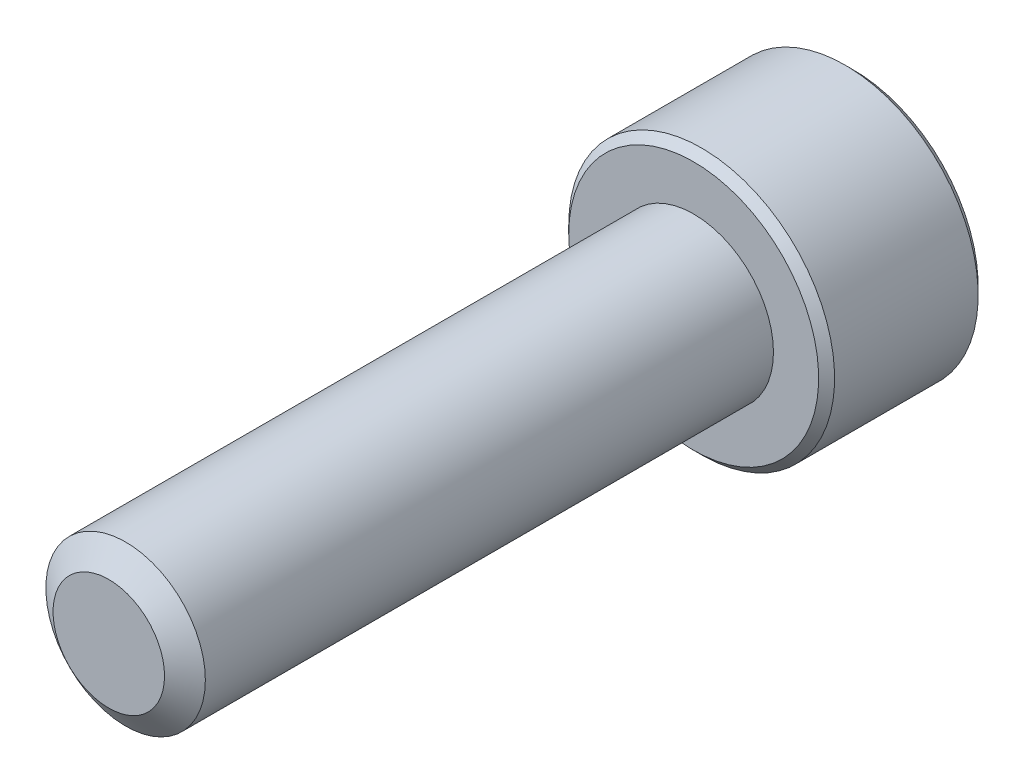
ISO-10303-21;
HEADER;
FILE_DESCRIPTION(('STEP AP214'),'2;1');
FILE_NAME('part.step','',(''),(''),'','','');
FILE_SCHEMA(('AUTOMOTIVE_DESIGN { 1 0 10303 214 1 1 1 1 }'));
ENDSEC;
DATA;
#1=APPLICATION_CONTEXT('core data for automotive mechanical design processes');
#2=APPLICATION_PROTOCOL_DEFINITION('international standard','automotive_design',2000,#1);
#3=PRODUCT_CONTEXT('',#1,'mechanical');
#4=PRODUCT('Part','Part','',(#3));
#5=PRODUCT_RELATED_PRODUCT_CATEGORY('part','',(#4));
#6=PRODUCT_DEFINITION_FORMATION('','',#4);
#7=PRODUCT_DEFINITION_CONTEXT('part definition',#1,'design');
#8=PRODUCT_DEFINITION('design','',#6,#7);
#9=PRODUCT_DEFINITION_SHAPE('','',#8);
#10=(LENGTH_UNIT() NAMED_UNIT(*) SI_UNIT(.MILLI.,.METRE.));
#11=(NAMED_UNIT(*) PLANE_ANGLE_UNIT() SI_UNIT($,.RADIAN.));
#12=(NAMED_UNIT(*) SI_UNIT($,.STERADIAN.) SOLID_ANGLE_UNIT());
#13=UNCERTAINTY_MEASURE_WITH_UNIT(LENGTH_MEASURE(1.E-05),#10,'distance_accuracy_value','');
#14=(GEOMETRIC_REPRESENTATION_CONTEXT(3) GLOBAL_UNCERTAINTY_ASSIGNED_CONTEXT((#13)) GLOBAL_UNIT_ASSIGNED_CONTEXT((#10,
#11,#12)) REPRESENTATION_CONTEXT('',''));
#15=CARTESIAN_POINT('',(0.,0.,0.));
#16=DIRECTION('',(0.,0.,1.));
#17=DIRECTION('',(1.,0.,0.));
#18=AXIS2_PLACEMENT_3D('',#15,#16,#17);
#19=CARTESIAN_POINT('',(0.,0.,-22.));
#20=DIRECTION('',(0.,0.,1.));
#21=DIRECTION('',(1.,0.,0.));
#22=AXIS2_PLACEMENT_3D('',#19,#20,#21);
#23=CYLINDRICAL_SURFACE('',#22,3.);
#24=CARTESIAN_POINT('',(0.,0.,-0.632650851713494));
#25=DIRECTION('',(0.,0.,1.));
#26=DIRECTION('',(1.,0.,0.));
#27=AXIS2_PLACEMENT_3D('',#24,#25,#26);
#28=CIRCLE('',#27,3.);
#29=CARTESIAN_POINT('',(3.,0.,-0.632650851713494));
#30=VERTEX_POINT('',#29);
#31=EDGE_CURVE('E110',#30,#30,#28,.T.);
#32=ORIENTED_EDGE('',*,*,#31,.F.);
#33=EDGE_LOOP('',(#32));
#34=FACE_BOUND('',#33,.T.);
#35=CARTESIAN_POINT('',(0.,0.,-22.));
#36=DIRECTION('',(0.,0.,-1.));
#37=DIRECTION('',(-1.,0.,0.));
#38=AXIS2_PLACEMENT_3D('',#35,#36,#37);
#39=CIRCLE('',#38,3.);
#40=CARTESIAN_POINT('',(-3.,0.,-22.));
#41=VERTEX_POINT('',#40);
#42=EDGE_CURVE('E216',#41,#41,#39,.F.);
#43=ORIENTED_EDGE('',*,*,#42,.T.);
#44=EDGE_LOOP('',(#43));
#45=FACE_BOUND('',#44,.T.);
#46=ADVANCED_FACE('F36',(#34,#45),#23,.T.);
#47=CARTESIAN_POINT('',(0.,0.,0.));
#48=DIRECTION('',(0.,0.,-1.));
#49=DIRECTION('',(-1.,0.,0.));
#50=AXIS2_PLACEMENT_3D('',#47,#48,#49);
#51=CONICAL_SURFACE('',#50,2.09648094716167,0.959931088596884);
#52=ORIENTED_EDGE('',*,*,#31,.T.);
#53=EDGE_LOOP('',(#52));
#54=FACE_BOUND('',#53,.T.);
#55=CARTESIAN_POINT('',(0.,0.,0.));
#56=DIRECTION('',(0.,0.,1.));
#57=DIRECTION('',(1.,0.,0.));
#58=AXIS2_PLACEMENT_3D('',#55,#56,#57);
#59=CIRCLE('',#58,2.09648094716167);
#60=CARTESIAN_POINT('',(2.09648094716167,0.,0.));
#61=VERTEX_POINT('',#60);
#62=EDGE_CURVE('E214',#61,#61,#59,.T.);
#63=ORIENTED_EDGE('',*,*,#62,.F.);
#64=EDGE_LOOP('',(#63));
#65=FACE_BOUND('',#64,.T.);
#66=ADVANCED_FACE('F197',(#54,#65),#51,.T.);
#67=CARTESIAN_POINT('',(0.,0.,0.));
#68=DIRECTION('',(0.,0.,1.));
#69=DIRECTION('',(1.,0.,0.));
#70=AXIS2_PLACEMENT_3D('',#67,#68,#69);
#71=PLANE('',#70);
#72=ORIENTED_EDGE('',*,*,#62,.T.);
#73=EDGE_LOOP('',(#72));
#74=FACE_BOUND('',#73,.T.);
#75=ADVANCED_FACE('F194',(#74),#71,.T.);
#76=CARTESIAN_POINT('',(0.,0.,-28.));
#77=DIRECTION('',(0.,0.,1.));
#78=DIRECTION('',(1.,0.,0.));
#79=AXIS2_PLACEMENT_3D('',#76,#77,#78);
#80=CYLINDRICAL_SURFACE('',#79,5.);
#81=CARTESIAN_POINT('',(0.,0.,-27.7));
#82=DIRECTION('',(0.,0.,-1.));
#83=DIRECTION('',(-1.,0.,0.));
#84=AXIS2_PLACEMENT_3D('',#81,#82,#83);
#85=CIRCLE('',#84,5.);
#86=CARTESIAN_POINT('',(-5.,0.,-27.7));
#87=VERTEX_POINT('',#86);
#88=EDGE_CURVE('E44',#87,#87,#85,.F.);
#89=ORIENTED_EDGE('',*,*,#88,.T.);
#90=EDGE_LOOP('',(#89));
#91=FACE_BOUND('',#90,.T.);
#92=CARTESIAN_POINT('',(0.,0.,-22.3));
#93=DIRECTION('',(0.,0.,-1.));
#94=DIRECTION('',(-1.,0.,0.));
#95=AXIS2_PLACEMENT_3D('',#92,#93,#94);
#96=CIRCLE('',#95,5.);
#97=CARTESIAN_POINT('',(-5.,0.,-22.3));
#98=VERTEX_POINT('',#97);
#99=EDGE_CURVE('E173',#98,#98,#96,.T.);
#100=ORIENTED_EDGE('',*,*,#99,.T.);
#101=EDGE_LOOP('',(#100));
#102=FACE_BOUND('',#101,.T.);
#103=ADVANCED_FACE('F178',(#91,#102),#80,.T.);
#104=CARTESIAN_POINT('',(0.,0.,-28.));
#105=DIRECTION('',(0.,0.,-1.));
#106=DIRECTION('',(-1.,0.,0.));
#107=AXIS2_PLACEMENT_3D('',#104,#105,#106);
#108=PLANE('',#107);
#109=CARTESIAN_POINT('',(0.,0.,-28.));
#110=DIRECTION('',(0.,0.,-1.));
#111=DIRECTION('',(-1.,0.,0.));
#112=AXIS2_PLACEMENT_3D('',#109,#110,#111);
#113=CIRCLE('',#112,4.7);
#114=CARTESIAN_POINT('',(-4.7,0.,-28.));
#115=VERTEX_POINT('',#114);
#116=EDGE_CURVE('E109',#115,#115,#113,.T.);
#117=ORIENTED_EDGE('',*,*,#116,.T.);
#118=EDGE_LOOP('',(#117));
#119=FACE_BOUND('',#118,.T.);
#120=CARTESIAN_POINT('',(0.,0.,-28.));
#121=DIRECTION('',(0.,0.,-1.));
#122=DIRECTION('',(-1.,0.,0.));
#123=AXIS2_PLACEMENT_3D('',#120,#121,#122);
#124=CIRCLE('',#123,2.88675134594813);
#125=CARTESIAN_POINT('',(-2.5,1.44337567297407,-28.));
#126=VERTEX_POINT('',#125);
#127=CARTESIAN_POINT('',(0.,2.88675134594813,-28.));
#128=VERTEX_POINT('',#127);
#129=EDGE_CURVE('E90',#126,#128,#124,.T.);
#130=ORIENTED_EDGE('',*,*,#129,.F.);
#131=CARTESIAN_POINT('',(-2.5,-1.44337567297406,-28.));
#132=VERTEX_POINT('',#131);
#133=EDGE_CURVE('E50',#132,#126,#124,.T.);
#134=ORIENTED_EDGE('',*,*,#133,.F.);
#135=CARTESIAN_POINT('',(0.,-2.88675134594813,-28.));
#136=VERTEX_POINT('',#135);
#137=EDGE_CURVE('E276',#136,#132,#124,.T.);
#138=ORIENTED_EDGE('',*,*,#137,.F.);
#139=CARTESIAN_POINT('',(2.5,-1.44337567297406,-28.));
#140=VERTEX_POINT('',#139);
#141=EDGE_CURVE('E57',#140,#136,#124,.T.);
#142=ORIENTED_EDGE('',*,*,#141,.F.);
#143=CARTESIAN_POINT('',(2.5,1.44337567297407,-28.));
#144=VERTEX_POINT('',#143);
#145=EDGE_CURVE('E131',#144,#140,#124,.T.);
#146=ORIENTED_EDGE('',*,*,#145,.F.);
#147=EDGE_CURVE('E99',#128,#144,#124,.T.);
#148=ORIENTED_EDGE('',*,*,#147,.F.);
#149=EDGE_LOOP('',(#130,#134,#138,#142,#146,#148));
#150=FACE_BOUND('',#149,.T.);
#151=ADVANCED_FACE('F130',(#119,#150),#108,.T.);
#152=CARTESIAN_POINT('',(0.,0.,-22.));
#153=DIRECTION('',(0.,0.,-1.));
#154=DIRECTION('',(-1.,0.,0.));
#155=AXIS2_PLACEMENT_3D('',#152,#153,#154);
#156=PLANE('',#155);
#157=CARTESIAN_POINT('',(0.,0.,-22.));
#158=DIRECTION('',(0.,0.,-1.));
#159=DIRECTION('',(-1.,0.,0.));
#160=AXIS2_PLACEMENT_3D('',#157,#158,#159);
#161=CIRCLE('',#160,4.7);
#162=CARTESIAN_POINT('',(-4.69999999999999,0.,-22.));
#163=VERTEX_POINT('',#162);
#164=EDGE_CURVE('E11',#163,#163,#161,.F.);
#165=ORIENTED_EDGE('',*,*,#164,.T.);
#166=EDGE_LOOP('',(#165));
#167=FACE_BOUND('',#166,.T.);
#168=ORIENTED_EDGE('',*,*,#42,.F.);
#169=EDGE_LOOP('',(#168));
#170=FACE_BOUND('',#169,.T.);
#171=ADVANCED_FACE('F187',(#167,#170),#156,.F.);
#172=CARTESIAN_POINT('',(0.,0.,-28.));
#173=DIRECTION('',(0.,0.,-1.));
#174=DIRECTION('',(-1.,0.,0.));
#175=AXIS2_PLACEMENT_3D('',#172,#173,#174);
#176=CONICAL_SURFACE('',#175,2.88675134594813,0.78539816339745);
#177=ORIENTED_EDGE('',*,*,#147,.T.);
#178=CARTESIAN_POINT('',(-0.000200000000000246,2.88686681600197,-28.0001154769818));
#179=CARTESIAN_POINT('',(0.0857382777877643,2.83725032818751,-27.9505407053547));
#180=CARTESIAN_POINT('',(0.173113567275753,2.7868041812811,-27.9038774813625));
#181=CARTESIAN_POINT('',(0.351281456165589,2.6839389026696,-27.8184381400383));
#182=CARTESIAN_POINT('',(0.442091000681076,2.6315099876986,-27.779709562406));
#183=CARTESIAN_POINT('',(0.625204123126922,2.52578957716234,-27.7133667038977));
#184=CARTESIAN_POINT('',(0.717461064529341,2.47252500720904,-27.6855856685309));
#185=CARTESIAN_POINT('',(0.904006008776286,2.3648232334321,-27.6427831759107));
#186=CARTESIAN_POINT('',(0.998288312566283,2.31038931995913,-27.6277297666713));
#187=CARTESIAN_POINT('',(1.16077825829184,2.21657570605387,-27.6141477222095));
#188=CARTESIAN_POINT('',(1.22877596788015,2.17731721011878,-27.6121370992408));
#189=CARTESIAN_POINT('',(1.36466024116922,2.0988643883567,-27.6155241171875));
#190=CARTESIAN_POINT('',(1.43254675755224,2.05967008984862,-27.6209243552998));
#191=CARTESIAN_POINT('',(1.56767878823611,1.98165157555715,-27.6388257884025));
#192=CARTESIAN_POINT('',(1.63492349975356,1.94282782326097,-27.6513349270465));
#193=CARTESIAN_POINT('',(1.7682501008182,1.86585167424616,-27.6827675019557));
#194=CARTESIAN_POINT('',(1.83433207909966,1.82769922629678,-27.7016904464968));
#195=CARTESIAN_POINT('',(2.00359634669126,1.72997445583858,-27.7578673614082));
#196=CARTESIAN_POINT('',(2.10572912222289,1.67100807039231,-27.7993558315962));
#197=CARTESIAN_POINT('',(2.25590641494051,1.58430317001562,-27.8693940467231));
#198=CARTESIAN_POINT('',(2.30539653988261,1.55573003305807,-27.8940022521161));
#199=CARTESIAN_POINT('',(2.40346006383885,1.49911303110426,-27.9454618867152));
#200=CARTESIAN_POINT('',(2.45203400349693,1.47106885396706,-27.9723119387794));
#201=CARTESIAN_POINT('',(2.5002,1.44326020292023,-28.0001154769818));
#202=B_SPLINE_CURVE_WITH_KNOTS('',3,(#178,#179,#180,#181,#182,#183,#184,#185,#186,#187,#188,
#189,#190,#191,#192,#193,#194,#195,#196,#197,#198,#199,#200,#201),.UNSPECIFIED.,.F.,.F.,(4,2,2,
2,2,2,2,2,2,2,2,4),(0.,0.333012085133925,0.6679645183014,0.997597032043301,1.32639954393844,
1.56169424147169,1.79707142102083,2.03271213522171,2.26833478775651,2.64260240809533,
2.82922877818864,3.01574133749025),.UNSPECIFIED.);
#203=EDGE_CURVE('E104',#128,#144,#202,.T.);
#204=ORIENTED_EDGE('',*,*,#203,.F.);
#205=EDGE_LOOP('',(#177,#204));
#206=FACE_BOUND('',#205,.T.);
#207=ADVANCED_FACE('F105',(#206),#176,.F.);
#208=ORIENTED_EDGE('',*,*,#145,.T.);
#209=CARTESIAN_POINT('',(2.5,-2.87868021616154,-28.9259641937847));
#210=CARTESIAN_POINT('',(2.5,-2.80858751756355,-28.8730547693995));
#211=CARTESIAN_POINT('',(2.5,-2.73810237384458,-28.8206567848064));
#212=CARTESIAN_POINT('',(2.5,-2.59619238907469,-28.7171126835152));
#213=CARTESIAN_POINT('',(2.5,-2.52476731657143,-28.6659668843779));
#214=CARTESIAN_POINT('',(2.5,-2.38030019419698,-28.5647924979814));
#215=CARTESIAN_POINT('',(2.5,-2.307249903594,-28.5147756377845));
#216=CARTESIAN_POINT('',(2.5,-2.15990937397294,-28.4166088439155));
#217=CARTESIAN_POINT('',(2.5,-2.08561922308943,-28.3684587783455));
#218=CARTESIAN_POINT('',(2.5,-1.93130274871409,-28.271746559452));
#219=CARTESIAN_POINT('',(2.5,-1.8511916849785,-28.2233189325373));
#220=CARTESIAN_POINT('',(2.5,-1.68912282627168,-28.1296640597041));
#221=CARTESIAN_POINT('',(2.5,-1.60716527674864,-28.0844363916948));
#222=CARTESIAN_POINT('',(2.5,-1.44137668632319,-27.9981353746693));
#223=CARTESIAN_POINT('',(2.5,-1.35755175925796,-27.9570503726636));
#224=CARTESIAN_POINT('',(2.5,-1.1876157775942,-27.8799618661066));
#225=CARTESIAN_POINT('',(2.5,-1.10150577924729,-27.8439560607346));
#226=CARTESIAN_POINT('',(2.5,-0.933895283730372,-27.7809497442851));
#227=CARTESIAN_POINT('',(2.5,-0.85258148665241,-27.7534577201431));
#228=CARTESIAN_POINT('',(2.5,-0.687996185051424,-27.7049971144174));
#229=CARTESIAN_POINT('',(2.5,-0.604724546085161,-27.684028982239));
#230=CARTESIAN_POINT('',(2.5,-0.438105786501648,-27.650059995013));
#231=CARTESIAN_POINT('',(2.5,-0.35478695737788,-27.6369226334436));
#232=CARTESIAN_POINT('',(2.5,-0.187258638268771,-27.6188701943996));
#233=CARTESIAN_POINT('',(2.5,-0.103049303891732,-27.6139537035302));
#234=CARTESIAN_POINT('',(2.5,0.0623819458555497,-27.6127080743719));
#235=CARTESIAN_POINT('',(2.5,0.143601667742495,-27.6160745517109));
#236=CARTESIAN_POINT('',(2.5,0.305344840533965,-27.6305375923809));
#237=CARTESIAN_POINT('',(2.5,0.385868223029658,-27.6416349066531));
#238=CARTESIAN_POINT('',(2.5,0.546999992477731,-27.6711420785853));
#239=CARTESIAN_POINT('',(2.5,0.62758525815638,-27.6896763768309));
#240=CARTESIAN_POINT('',(2.5,0.786991930978588,-27.7330723320141));
#241=CARTESIAN_POINT('',(2.5,0.865813485110825,-27.7579334595174));
#242=CARTESIAN_POINT('',(2.5,1.11399280220491,-27.8455589112399));
#243=CARTESIAN_POINT('',(2.5,1.27984027529456,-27.9183033354746));
#244=CARTESIAN_POINT('',(2.5,1.52253018655038,-28.0395423452678));
#245=CARTESIAN_POINT('',(2.5,1.60256472908879,-28.0820714512072));
#246=CARTESIAN_POINT('',(2.5,1.76081489282124,-28.1703965241522));
#247=CARTESIAN_POINT('',(2.5,1.83903083842887,-28.2161919024767));
#248=CARTESIAN_POINT('',(2.5,1.99000684607168,-28.3080446787286));
#249=CARTESIAN_POINT('',(2.5,2.06284472030444,-28.3539756354245));
#250=CARTESIAN_POINT('',(2.5,2.20727164736135,-28.4477702453865));
#251=CARTESIAN_POINT('',(2.5,2.27886060500402,-28.4956340450436));
#252=CARTESIAN_POINT('',(2.5,2.42037078548403,-28.5925522363183));
#253=CARTESIAN_POINT('',(2.5,2.49030083172878,-28.6415937983162));
#254=CARTESIAN_POINT('',(2.5,2.62920524991558,-28.7409738351898));
#255=CARTESIAN_POINT('',(2.5,2.69817987937839,-28.7913119497074));
#256=CARTESIAN_POINT('',(2.5,2.76675463365823,-28.8421802976824));
#257=B_SPLINE_CURVE_WITH_KNOTS('',3,(#209,#210,#211,#212,#213,#214,#215,#216,#217,#218,#219,
#220,#221,#222,#223,#224,#225,#226,#227,#228,#229,#230,#231,#232,#233,#234,#235,#236,#237,#238,
#239,#240,#241,#242,#243,#244,#245,#246,#247,#248,#249,#250,#251,#252,#253,#254,#255,#256),
.UNSPECIFIED.,.F.,.F.,(4,2,2,2,2,2,2,2,2,2,2,2,2,2,2,2,2,2,2,2,2,2,2,4),(0.,0.263465914971114,
0.526997968323237,0.792571943279359,1.05812711983771,1.33890112548018,1.61963802629079,
1.89956181222216,2.17935838571897,2.436638876826,2.69393708705248,2.94660788173135,
3.19923523085016,3.44271854486786,3.68622551313359,3.93398926860573,4.18173229781968,
4.72334004841908,4.99521600382014,5.26704308216966,5.52534341671993,5.78366335141086,
6.03988492204046,6.29603603207541),.UNSPECIFIED.);
#258=EDGE_CURVE('E98',#144,#140,#257,.F.);
#259=ORIENTED_EDGE('',*,*,#258,.F.);
#260=EDGE_LOOP('',(#208,#259));
#261=FACE_BOUND('',#260,.T.);
#262=ADVANCED_FACE('F282',(#261),#176,.F.);
#263=ORIENTED_EDGE('',*,*,#141,.T.);
#264=CARTESIAN_POINT('',(2.5002,-1.44326020292023,-28.0001154769818));
#265=CARTESIAN_POINT('',(2.41426172221224,-1.49287669073469,-27.9505407053547));
#266=CARTESIAN_POINT('',(2.32688643272425,-1.5433228376411,-27.9038774813625));
#267=CARTESIAN_POINT('',(2.14871854383441,-1.64618811625259,-27.8184381400383));
#268=CARTESIAN_POINT('',(2.05790899931893,-1.69861703122359,-27.779709562406));
#269=CARTESIAN_POINT('',(1.87479587687308,-1.80433744175986,-27.7133667038977));
#270=CARTESIAN_POINT('',(1.78253893547066,-1.85760201171316,-27.6855856685309));
#271=CARTESIAN_POINT('',(1.59599399122371,-1.96530378549009,-27.6427831759107));
#272=CARTESIAN_POINT('',(1.50171168743372,-2.01973769896307,-27.6277297666713));
#273=CARTESIAN_POINT('',(1.33922174170816,-2.11355131286833,-27.6141477222095));
#274=CARTESIAN_POINT('',(1.27122403211985,-2.15280980880341,-27.6121370992408));
#275=CARTESIAN_POINT('',(1.13533975883078,-2.23126263056549,-27.6155241171875));
#276=CARTESIAN_POINT('',(1.06745324244776,-2.27045692907357,-27.6209243552998));
#277=CARTESIAN_POINT('',(0.932321211763895,-2.34847544336505,-27.6388257884025));
#278=CARTESIAN_POINT('',(0.86507650024644,-2.38729919566123,-27.6513349270465));
#279=CARTESIAN_POINT('',(0.731749899181802,-2.46427534467604,-27.6827675019557));
#280=CARTESIAN_POINT('',(0.665667920900344,-2.50242779262542,-27.7016904464968));
#281=CARTESIAN_POINT('',(0.496403653308736,-2.60015256308362,-27.7578673614082));
#282=CARTESIAN_POINT('',(0.394270877777108,-2.65911894852989,-27.7993558315962));
#283=CARTESIAN_POINT('',(0.244093585059492,-2.74582384890657,-27.8693940467231));
#284=CARTESIAN_POINT('',(0.194603460117392,-2.77439698586412,-27.8940022521161));
#285=CARTESIAN_POINT('',(0.0965399361611549,-2.83101398781794,-27.9454618867152));
#286=CARTESIAN_POINT('',(0.047965996503074,-2.85905816495513,-27.9723119387794));
#287=CARTESIAN_POINT('',(-0.000199999999997863,-2.88686681600197,-28.0001154769818));
#288=B_SPLINE_CURVE_WITH_KNOTS('',3,(#264,#265,#266,#267,#268,#269,#270,#271,#272,#273,#274,
#275,#276,#277,#278,#279,#280,#281,#282,#283,#284,#285,#286,#287),.UNSPECIFIED.,.F.,.F.,(4,2,2,
2,2,2,2,2,2,2,2,4),(0.,0.333012085133925,0.667964518301399,0.997597032043301,1.32639954393844,
1.56169424147169,1.79707142102083,2.03271213522171,2.26833478775651,2.64260240809533,
2.82922877818864,3.01574133749025),.UNSPECIFIED.);
#289=EDGE_CURVE('E141',#140,#136,#288,.T.);
#290=ORIENTED_EDGE('',*,*,#289,.F.);
#291=EDGE_LOOP('',(#263,#290));
#292=FACE_BOUND('',#291,.T.);
#293=ADVANCED_FACE('F279',(#292),#176,.F.);
#294=ORIENTED_EDGE('',*,*,#137,.T.);
#295=CARTESIAN_POINT('',(0.000200000000001078,-2.88686681600197,-28.0001154769818));
#296=CARTESIAN_POINT('',(-0.0857382777877634,-2.83725032818751,-27.9505407053547));
#297=CARTESIAN_POINT('',(-0.173113567275752,-2.7868041812811,-27.9038774813625));
#298=CARTESIAN_POINT('',(-0.351281456165588,-2.6839389026696,-27.8184381400383));
#299=CARTESIAN_POINT('',(-0.442091000681075,-2.6315099876986,-27.779709562406));
#300=CARTESIAN_POINT('',(-0.625204123126922,-2.52578957716234,-27.7133667038977));
#301=CARTESIAN_POINT('',(-0.717461064529342,-2.47252500720904,-27.6855856685309));
#302=CARTESIAN_POINT('',(-0.904006008776288,-2.3648232334321,-27.6427831759107));
#303=CARTESIAN_POINT('',(-0.998288312566285,-2.31038931995913,-27.6277297666713));
#304=CARTESIAN_POINT('',(-1.16077825829185,-2.21657570605386,-27.6141477222095));
#305=CARTESIAN_POINT('',(-1.22877596788015,-2.17731721011878,-27.6121370992408));
#306=CARTESIAN_POINT('',(-1.36466024116922,-2.0988643883567,-27.6155241171875));
#307=CARTESIAN_POINT('',(-1.43254675755224,-2.05967008984862,-27.6209243552998));
#308=CARTESIAN_POINT('',(-1.56767878823611,-1.98165157555714,-27.6388257884025));
#309=CARTESIAN_POINT('',(-1.63492349975356,-1.94282782326096,-27.6513349270465));
#310=CARTESIAN_POINT('',(-1.7682501008182,-1.86585167424616,-27.6827675019557));
#311=CARTESIAN_POINT('',(-1.83433207909966,-1.82769922629677,-27.7016904464968));
#312=CARTESIAN_POINT('',(-2.00359634669127,-1.72997445583857,-27.7578673614082));
#313=CARTESIAN_POINT('',(-2.10572912222289,-1.67100807039231,-27.7993558315962));
#314=CARTESIAN_POINT('',(-2.25590641494051,-1.58430317001562,-27.8693940467231));
#315=CARTESIAN_POINT('',(-2.30539653988261,-1.55573003305807,-27.8940022521161));
#316=CARTESIAN_POINT('',(-2.40346006383885,-1.49911303110426,-27.9454618867152));
#317=CARTESIAN_POINT('',(-2.45203400349693,-1.47106885396706,-27.9723119387794));
#318=CARTESIAN_POINT('',(-2.5002,-1.44326020292023,-28.0001154769818));
#319=B_SPLINE_CURVE_WITH_KNOTS('',3,(#295,#296,#297,#298,#299,#300,#301,#302,#303,#304,#305,
#306,#307,#308,#309,#310,#311,#312,#313,#314,#315,#316,#317,#318),.UNSPECIFIED.,.F.,.F.,(4,2,2,
2,2,2,2,2,2,2,2,4),(0.,0.333012085133925,0.6679645183014,0.997597032043303,1.32639954393845,
1.56169424147169,1.79707142102083,2.03271213522171,2.26833478775651,2.64260240809533,
2.82922877818864,3.01574133749025),.UNSPECIFIED.);
#320=EDGE_CURVE('E253',#136,#132,#319,.T.);
#321=ORIENTED_EDGE('',*,*,#320,.F.);
#322=EDGE_LOOP('',(#294,#321));
#323=FACE_BOUND('',#322,.T.);
#324=ADVANCED_FACE('F278',(#323),#176,.F.);
#325=ORIENTED_EDGE('',*,*,#133,.T.);
#326=CARTESIAN_POINT('',(-2.5,-2.87868021616154,-28.9259641937847));
#327=CARTESIAN_POINT('',(-2.5,-2.80858751756355,-28.8730547693995));
#328=CARTESIAN_POINT('',(-2.5,-2.73810237384457,-28.8206567848064));
#329=CARTESIAN_POINT('',(-2.5,-2.59619238907469,-28.7171126835152));
#330=CARTESIAN_POINT('',(-2.5,-2.52476731657143,-28.6659668843779));
#331=CARTESIAN_POINT('',(-2.5,-2.38030019419698,-28.5647924979814));
#332=CARTESIAN_POINT('',(-2.5,-2.307249903594,-28.5147756377845));
#333=CARTESIAN_POINT('',(-2.5,-2.15990937397294,-28.4166088439155));
#334=CARTESIAN_POINT('',(-2.5,-2.08561922308943,-28.3684587783455));
#335=CARTESIAN_POINT('',(-2.5,-1.93130274871408,-28.271746559452));
#336=CARTESIAN_POINT('',(-2.5,-1.8511916849785,-28.2233189325373));
#337=CARTESIAN_POINT('',(-2.5,-1.68912282627168,-28.1296640597041));
#338=CARTESIAN_POINT('',(-2.5,-1.60716527674864,-28.0844363916948));
#339=CARTESIAN_POINT('',(-2.5,-1.44137668632319,-27.9981353746693));
#340=CARTESIAN_POINT('',(-2.5,-1.35755175925796,-27.9570503726636));
#341=CARTESIAN_POINT('',(-2.5,-1.1876157775942,-27.8799618661066));
#342=CARTESIAN_POINT('',(-2.5,-1.10150577924729,-27.8439560607346));
#343=CARTESIAN_POINT('',(-2.5,-0.933895283730374,-27.7809497442851));
#344=CARTESIAN_POINT('',(-2.5,-0.852581486652411,-27.7534577201431));
#345=CARTESIAN_POINT('',(-2.5,-0.687996185051425,-27.7049971144174));
#346=CARTESIAN_POINT('',(-2.5,-0.604724546085163,-27.684028982239));
#347=CARTESIAN_POINT('',(-2.5,-0.43810578650165,-27.650059995013));
#348=CARTESIAN_POINT('',(-2.5,-0.354786957377881,-27.6369226334436));
#349=CARTESIAN_POINT('',(-2.5,-0.187258638268772,-27.6188701943996));
#350=CARTESIAN_POINT('',(-2.5,-0.103049303891733,-27.6139537035302));
#351=CARTESIAN_POINT('',(-2.5,0.0623819458555487,-27.6127080743719));
#352=CARTESIAN_POINT('',(-2.5,0.143601667742494,-27.6160745517109));
#353=CARTESIAN_POINT('',(-2.5,0.305344840533964,-27.6305375923809));
#354=CARTESIAN_POINT('',(-2.5,0.385868223029657,-27.6416349066531));
#355=CARTESIAN_POINT('',(-2.5,0.54699999247773,-27.6711420785853));
#356=CARTESIAN_POINT('',(-2.5,0.627585258156378,-27.6896763768309));
#357=CARTESIAN_POINT('',(-2.5,0.786991930978586,-27.7330723320141));
#358=CARTESIAN_POINT('',(-2.5,0.865813485110823,-27.7579334595174));
#359=CARTESIAN_POINT('',(-2.5,1.11399280220491,-27.8455589112399));
#360=CARTESIAN_POINT('',(-2.5,1.27984027529456,-27.9183033354746));
#361=CARTESIAN_POINT('',(-2.5,1.52253018655038,-28.0395423452678));
#362=CARTESIAN_POINT('',(-2.5,1.60256472908879,-28.0820714512072));
#363=CARTESIAN_POINT('',(-2.5,1.76081489282124,-28.1703965241522));
#364=CARTESIAN_POINT('',(-2.5,1.83903083842886,-28.2161919024767));
#365=CARTESIAN_POINT('',(-2.5,1.99000684607167,-28.3080446787286));
#366=CARTESIAN_POINT('',(-2.5,2.06284472030444,-28.3539756354245));
#367=CARTESIAN_POINT('',(-2.5,2.20727164736135,-28.4477702453865));
#368=CARTESIAN_POINT('',(-2.5,2.27886060500402,-28.4956340450436));
#369=CARTESIAN_POINT('',(-2.5,2.42037078548403,-28.5925522363183));
#370=CARTESIAN_POINT('',(-2.5,2.49030083172878,-28.6415937983162));
#371=CARTESIAN_POINT('',(-2.5,2.62920524991558,-28.7409738351898));
#372=CARTESIAN_POINT('',(-2.5,2.69817987937839,-28.7913119497074));
#373=CARTESIAN_POINT('',(-2.5,2.76675463365823,-28.8421802976824));
#374=B_SPLINE_CURVE_WITH_KNOTS('',3,(#326,#327,#328,#329,#330,#331,#332,#333,#334,#335,#336,
#337,#338,#339,#340,#341,#342,#343,#344,#345,#346,#347,#348,#349,#350,#351,#352,#353,#354,#355,
#356,#357,#358,#359,#360,#361,#362,#363,#364,#365,#366,#367,#368,#369,#370,#371,#372,#373),
.UNSPECIFIED.,.F.,.F.,(4,2,2,2,2,2,2,2,2,2,2,2,2,2,2,2,2,2,2,2,2,2,2,4),(0.,0.263465914971115,
0.526997968323237,0.792571943279359,1.05812711983771,1.33890112548018,1.61963802629079,
1.89956181222216,2.17935838571897,2.436638876826,2.69393708705248,2.94660788173135,
3.19923523085015,3.44271854486786,3.68622551313359,3.93398926860573,4.18173229781968,
4.72334004841907,4.99521600382014,5.26704308216966,5.52534341671993,5.78366335141086,
6.03988492204046,6.29603603207541),.UNSPECIFIED.);
#375=EDGE_CURVE('E120',#132,#126,#374,.T.);
#376=ORIENTED_EDGE('',*,*,#375,.F.);
#377=EDGE_LOOP('',(#325,#376));
#378=FACE_BOUND('',#377,.T.);
#379=ADVANCED_FACE('F291',(#378),#176,.F.);
#380=ORIENTED_EDGE('',*,*,#129,.T.);
#381=CARTESIAN_POINT('',(-2.5002,1.44326020292023,-28.0001154769818));
#382=CARTESIAN_POINT('',(-2.41426172221224,1.49287669073469,-27.9505407053547));
#383=CARTESIAN_POINT('',(-2.32688643272425,1.5433228376411,-27.9038774813625));
#384=CARTESIAN_POINT('',(-2.14871854383441,1.64618811625259,-27.8184381400383));
#385=CARTESIAN_POINT('',(-2.05790899931893,1.69861703122359,-27.779709562406));
#386=CARTESIAN_POINT('',(-1.87479587687308,1.80433744175986,-27.7133667038977));
#387=CARTESIAN_POINT('',(-1.78253893547066,1.85760201171316,-27.6855856685309));
#388=CARTESIAN_POINT('',(-1.59599399122371,1.96530378549009,-27.6427831759107));
#389=CARTESIAN_POINT('',(-1.50171168743372,2.01973769896307,-27.6277297666713));
#390=CARTESIAN_POINT('',(-1.33922174170816,2.11355131286833,-27.6141477222095));
#391=CARTESIAN_POINT('',(-1.27122403211985,2.15280980880341,-27.6121370992408));
#392=CARTESIAN_POINT('',(-1.13533975883078,2.23126263056549,-27.6155241171875));
#393=CARTESIAN_POINT('',(-1.06745324244776,2.27045692907358,-27.6209243552998));
#394=CARTESIAN_POINT('',(-0.932321211763895,2.34847544336505,-27.6388257884025));
#395=CARTESIAN_POINT('',(-0.86507650024644,2.38729919566123,-27.6513349270465));
#396=CARTESIAN_POINT('',(-0.731749899181802,2.46427534467604,-27.6827675019557));
#397=CARTESIAN_POINT('',(-0.665667920900344,2.50242779262542,-27.7016904464968));
#398=CARTESIAN_POINT('',(-0.496403653308736,2.60015256308362,-27.7578673614082));
#399=CARTESIAN_POINT('',(-0.394270877777107,2.65911894852989,-27.7993558315962));
#400=CARTESIAN_POINT('',(-0.244093585059491,2.74582384890657,-27.8693940467231));
#401=CARTESIAN_POINT('',(-0.19460346011739,2.77439698586412,-27.8940022521161));
#402=CARTESIAN_POINT('',(-0.0965399361611529,2.83101398781794,-27.9454618867152));
#403=CARTESIAN_POINT('',(-0.0479659965030715,2.85905816495513,-27.9723119387794));
#404=CARTESIAN_POINT('',(0.000200000000000497,2.88686681600197,-28.0001154769818));
#405=B_SPLINE_CURVE_WITH_KNOTS('',3,(#381,#382,#383,#384,#385,#386,#387,#388,#389,#390,#391,
#392,#393,#394,#395,#396,#397,#398,#399,#400,#401,#402,#403,#404),.UNSPECIFIED.,.F.,.F.,(4,2,2,
2,2,2,2,2,2,2,2,4),(0.,0.333012085133925,0.667964518301397,0.9975970320433,1.32639954393844,
1.56169424147169,1.79707142102083,2.03271213522171,2.26833478775651,2.64260240809533,
2.82922877818864,3.01574133749025),.UNSPECIFIED.);
#406=EDGE_CURVE('E94',#126,#128,#405,.T.);
#407=ORIENTED_EDGE('',*,*,#406,.F.);
#408=EDGE_LOOP('',(#380,#407));
#409=FACE_BOUND('',#408,.T.);
#410=ADVANCED_FACE('F92',(#409),#176,.F.);
#411=CARTESIAN_POINT('',(2.5,4.33012701892219,-24.25));
#412=DIRECTION('',(0.,0.,-1.));
#413=DIRECTION('',(-1.,0.,0.));
#414=AXIS2_PLACEMENT_3D('',#411,#412,#413);
#415=PLANE('',#414);
#416=DIRECTION('',(0.866025403784439,0.5,0.));
#417=VECTOR('',#416,1.);
#418=CARTESIAN_POINT('',(-2.5,1.44337567297407,-24.25));
#419=LINE('',#418,#417);
#420=CARTESIAN_POINT('',(-2.5,1.44337567297407,-24.25));
#421=VERTEX_POINT('',#420);
#422=CARTESIAN_POINT('',(0.,2.88675134594813,-24.25));
#423=VERTEX_POINT('',#422);
#424=EDGE_CURVE('E119',#421,#423,#419,.T.);
#425=ORIENTED_EDGE('',*,*,#424,.T.);
#426=DIRECTION('',(0.866025403784439,-0.5,0.));
#427=VECTOR('',#426,1.);
#428=CARTESIAN_POINT('',(0.,2.88675134594813,-24.25));
#429=LINE('',#428,#427);
#430=CARTESIAN_POINT('',(2.5,1.44337567297406,-24.25));
#431=VERTEX_POINT('',#430);
#432=EDGE_CURVE('E124',#423,#431,#429,.T.);
#433=ORIENTED_EDGE('',*,*,#432,.T.);
#434=DIRECTION('',(0.,-1.,0.));
#435=VECTOR('',#434,1.);
#436=CARTESIAN_POINT('',(2.5,1.44337567297406,-24.25));
#437=LINE('',#436,#435);
#438=CARTESIAN_POINT('',(2.5,-1.44337567297406,-24.25));
#439=VERTEX_POINT('',#438);
#440=EDGE_CURVE('E239',#431,#439,#437,.T.);
#441=ORIENTED_EDGE('',*,*,#440,.T.);
#442=DIRECTION('',(-0.866025403784439,-0.5,0.));
#443=VECTOR('',#442,1.);
#444=CARTESIAN_POINT('',(2.5,-1.44337567297406,-24.25));
#445=LINE('',#444,#443);
#446=CARTESIAN_POINT('',(0.,-2.88675134594813,-24.25));
#447=VERTEX_POINT('',#446);
#448=EDGE_CURVE('E236',#439,#447,#445,.T.);
#449=ORIENTED_EDGE('',*,*,#448,.T.);
#450=DIRECTION('',(-0.866025403784439,0.5,0.));
#451=VECTOR('',#450,1.);
#452=CARTESIAN_POINT('',(0.,-2.88675134594813,-24.25));
#453=LINE('',#452,#451);
#454=CARTESIAN_POINT('',(-2.5,-1.44337567297406,-24.25));
#455=VERTEX_POINT('',#454);
#456=EDGE_CURVE('E233',#447,#455,#453,.T.);
#457=ORIENTED_EDGE('',*,*,#456,.T.);
#458=DIRECTION('',(0.,1.,0.));
#459=VECTOR('',#458,1.);
#460=CARTESIAN_POINT('',(-2.5,-1.44337567297406,-24.25));
#461=LINE('',#460,#459);
#462=EDGE_CURVE('E127',#455,#421,#461,.T.);
#463=ORIENTED_EDGE('',*,*,#462,.T.);
#464=EDGE_LOOP('',(#425,#433,#441,#449,#457,#463));
#465=FACE_BOUND('',#464,.T.);
#466=ADVANCED_FACE('F161',(#465),#415,.T.);
#467=CARTESIAN_POINT('',(0.,2.88675134594813,-24.25));
#468=DIRECTION('',(0.5,0.866025403784439,0.));
#469=DIRECTION('',(-0.866025403784439,0.5,0.));
#470=AXIS2_PLACEMENT_3D('',#467,#468,#469);
#471=PLANE('',#470);
#472=DIRECTION('',(0.,0.,-1.));
#473=VECTOR('',#472,1.);
#474=CARTESIAN_POINT('',(0.,2.88675134594813,-24.25));
#475=LINE('',#474,#473);
#476=EDGE_CURVE('E116',#423,#128,#475,.T.);
#477=ORIENTED_EDGE('',*,*,#476,.T.);
#478=ORIENTED_EDGE('',*,*,#203,.T.);
#479=DIRECTION('',(0.,0.,-1.));
#480=VECTOR('',#479,1.);
#481=CARTESIAN_POINT('',(2.5,1.44337567297406,-24.25));
#482=LINE('',#481,#480);
#483=EDGE_CURVE('E126',#431,#144,#482,.T.);
#484=ORIENTED_EDGE('',*,*,#483,.F.);
#485=ORIENTED_EDGE('',*,*,#432,.F.);
#486=EDGE_LOOP('',(#477,#478,#484,#485));
#487=FACE_BOUND('',#486,.T.);
#488=ADVANCED_FACE('F122',(#487),#471,.F.);
#489=CARTESIAN_POINT('',(2.5,1.44337567297406,-24.25));
#490=DIRECTION('',(1.,0.,0.));
#491=DIRECTION('',(0.,0.,-1.));
#492=AXIS2_PLACEMENT_3D('',#489,#490,#491);
#493=PLANE('',#492);
#494=ORIENTED_EDGE('',*,*,#483,.T.);
#495=ORIENTED_EDGE('',*,*,#258,.T.);
#496=DIRECTION('',(0.,0.,-1.));
#497=VECTOR('',#496,1.);
#498=CARTESIAN_POINT('',(2.5,-1.44337567297406,-24.25));
#499=LINE('',#498,#497);
#500=EDGE_CURVE('E222',#439,#140,#499,.T.);
#501=ORIENTED_EDGE('',*,*,#500,.F.);
#502=ORIENTED_EDGE('',*,*,#440,.F.);
#503=EDGE_LOOP('',(#494,#495,#501,#502));
#504=FACE_BOUND('',#503,.T.);
#505=ADVANCED_FACE('F150',(#504),#493,.F.);
#506=CARTESIAN_POINT('',(2.5,-1.44337567297406,-24.25));
#507=DIRECTION('',(0.5,-0.866025403784439,0.));
#508=DIRECTION('',(0.866025403784439,0.5,0.));
#509=AXIS2_PLACEMENT_3D('',#506,#507,#508);
#510=PLANE('',#509);
#511=ORIENTED_EDGE('',*,*,#500,.T.);
#512=ORIENTED_EDGE('',*,*,#289,.T.);
#513=DIRECTION('',(0.,0.,-1.));
#514=VECTOR('',#513,1.);
#515=CARTESIAN_POINT('',(0.,-2.88675134594813,-24.25));
#516=LINE('',#515,#514);
#517=EDGE_CURVE('E225',#447,#136,#516,.T.);
#518=ORIENTED_EDGE('',*,*,#517,.F.);
#519=ORIENTED_EDGE('',*,*,#448,.F.);
#520=EDGE_LOOP('',(#511,#512,#518,#519));
#521=FACE_BOUND('',#520,.T.);
#522=ADVANCED_FACE('F154',(#521),#510,.F.);
#523=CARTESIAN_POINT('',(0.,-2.88675134594813,-24.25));
#524=DIRECTION('',(-0.5,-0.866025403784439,0.));
#525=DIRECTION('',(0.866025403784439,-0.5,0.));
#526=AXIS2_PLACEMENT_3D('',#523,#524,#525);
#527=PLANE('',#526);
#528=ORIENTED_EDGE('',*,*,#517,.T.);
#529=ORIENTED_EDGE('',*,*,#320,.T.);
#530=DIRECTION('',(0.,0.,-1.));
#531=VECTOR('',#530,1.);
#532=CARTESIAN_POINT('',(-2.5,-1.44337567297406,-24.25));
#533=LINE('',#532,#531);
#534=EDGE_CURVE('E228',#455,#132,#533,.T.);
#535=ORIENTED_EDGE('',*,*,#534,.F.);
#536=ORIENTED_EDGE('',*,*,#456,.F.);
#537=EDGE_LOOP('',(#528,#529,#535,#536));
#538=FACE_BOUND('',#537,.T.);
#539=ADVANCED_FACE('F261',(#538),#527,.F.);
#540=CARTESIAN_POINT('',(-2.5,-1.44337567297406,-24.25));
#541=DIRECTION('',(-1.,0.,0.));
#542=DIRECTION('',(0.,0.,1.));
#543=AXIS2_PLACEMENT_3D('',#540,#541,#542);
#544=PLANE('',#543);
#545=ORIENTED_EDGE('',*,*,#534,.T.);
#546=ORIENTED_EDGE('',*,*,#375,.T.);
#547=DIRECTION('',(0.,0.,-1.));
#548=VECTOR('',#547,1.);
#549=CARTESIAN_POINT('',(-2.5,1.44337567297407,-24.25));
#550=LINE('',#549,#548);
#551=EDGE_CURVE('E118',#421,#126,#550,.T.);
#552=ORIENTED_EDGE('',*,*,#551,.F.);
#553=ORIENTED_EDGE('',*,*,#462,.F.);
#554=EDGE_LOOP('',(#545,#546,#552,#553));
#555=FACE_BOUND('',#554,.T.);
#556=ADVANCED_FACE('F258',(#555),#544,.F.);
#557=CARTESIAN_POINT('',(-2.5,1.44337567297407,-24.25));
#558=DIRECTION('',(-0.5,0.866025403784439,0.));
#559=DIRECTION('',(-0.866025403784439,-0.5,0.));
#560=AXIS2_PLACEMENT_3D('',#557,#558,#559);
#561=PLANE('',#560);
#562=ORIENTED_EDGE('',*,*,#551,.T.);
#563=ORIENTED_EDGE('',*,*,#406,.T.);
#564=ORIENTED_EDGE('',*,*,#476,.F.);
#565=ORIENTED_EDGE('',*,*,#424,.F.);
#566=EDGE_LOOP('',(#562,#563,#564,#565));
#567=FACE_BOUND('',#566,.T.);
#568=ADVANCED_FACE('F114',(#567),#561,.F.);
#569=CARTESIAN_POINT('',(0.,0.,-28.));
#570=DIRECTION('',(0.,0.,1.));
#571=DIRECTION('',(1.,0.,0.));
#572=AXIS2_PLACEMENT_3D('',#569,#570,#571);
#573=CONICAL_SURFACE('',#572,4.7,0.785398163397447);
#574=ORIENTED_EDGE('',*,*,#88,.F.);
#575=EDGE_LOOP('',(#574));
#576=FACE_BOUND('',#575,.T.);
#577=ORIENTED_EDGE('',*,*,#116,.F.);
#578=EDGE_LOOP('',(#577));
#579=FACE_BOUND('',#578,.T.);
#580=ADVANCED_FACE('F181',(#576,#579),#573,.T.);
#581=CARTESIAN_POINT('',(0.,0.,-22.3));
#582=DIRECTION('',(0.,0.,-1.));
#583=DIRECTION('',(-1.,0.,0.));
#584=AXIS2_PLACEMENT_3D('',#581,#582,#583);
#585=CONICAL_SURFACE('',#584,5.,0.785398163397447);
#586=CARTESIAN_POINT('',(-4.69999999999999,0.,-22.));
#587=CARTESIAN_POINT('',(-4.70312499999999,0.,-22.003125));
#588=CARTESIAN_POINT('',(-4.70624999999999,0.,-22.00625));
#589=CARTESIAN_POINT('',(-4.71249999999999,0.,-22.0125));
#590=CARTESIAN_POINT('',(-4.71562499999999,0.,-22.015625));
#591=CARTESIAN_POINT('',(-4.721875,0.,-22.021875));
#592=CARTESIAN_POINT('',(-4.725,0.,-22.025));
#593=CARTESIAN_POINT('',(-4.73124999999999,0.,-22.03125));
#594=CARTESIAN_POINT('',(-4.73437499999999,0.,-22.034375));
#595=CARTESIAN_POINT('',(-4.740625,0.,-22.040625));
#596=CARTESIAN_POINT('',(-4.74375,0.,-22.04375));
#597=CARTESIAN_POINT('',(-4.75,0.,-22.05));
#598=CARTESIAN_POINT('',(-4.75312499999999,0.,-22.053125));
#599=CARTESIAN_POINT('',(-4.75937499999999,0.,-22.059375));
#600=CARTESIAN_POINT('',(-4.76249999999999,0.,-22.0625));
#601=CARTESIAN_POINT('',(-4.76875,0.,-22.06875));
#602=CARTESIAN_POINT('',(-4.771875,0.,-22.071875));
#603=CARTESIAN_POINT('',(-4.778125,0.,-22.078125));
#604=CARTESIAN_POINT('',(-4.78125,0.,-22.08125));
#605=CARTESIAN_POINT('',(-4.7875,0.,-22.0875));
#606=CARTESIAN_POINT('',(-4.79062499999999,0.,-22.090625));
#607=CARTESIAN_POINT('',(-4.796875,0.,-22.096875));
#608=CARTESIAN_POINT('',(-4.8,0.,-22.1));
#609=CARTESIAN_POINT('',(-4.80625,0.,-22.10625));
#610=CARTESIAN_POINT('',(-4.809375,0.,-22.109375));
#611=CARTESIAN_POINT('',(-4.815625,0.,-22.115625));
#612=CARTESIAN_POINT('',(-4.81875,0.,-22.11875));
#613=CARTESIAN_POINT('',(-4.825,0.,-22.125));
#614=CARTESIAN_POINT('',(-4.828125,0.,-22.128125));
#615=CARTESIAN_POINT('',(-4.834375,0.,-22.134375));
#616=CARTESIAN_POINT('',(-4.8375,0.,-22.1375));
#617=CARTESIAN_POINT('',(-4.84375,0.,-22.14375));
#618=CARTESIAN_POINT('',(-4.846875,0.,-22.146875));
#619=CARTESIAN_POINT('',(-4.853125,0.,-22.153125));
#620=CARTESIAN_POINT('',(-4.85625,0.,-22.15625));
#621=CARTESIAN_POINT('',(-4.8625,0.,-22.1625));
#622=CARTESIAN_POINT('',(-4.865625,0.,-22.165625));
#623=CARTESIAN_POINT('',(-4.871875,0.,-22.171875));
#624=CARTESIAN_POINT('',(-4.875,0.,-22.175));
#625=CARTESIAN_POINT('',(-4.88125,0.,-22.18125));
#626=CARTESIAN_POINT('',(-4.884375,0.,-22.184375));
#627=CARTESIAN_POINT('',(-4.890625,0.,-22.190625));
#628=CARTESIAN_POINT('',(-4.89375,0.,-22.19375));
#629=CARTESIAN_POINT('',(-4.9,0.,-22.2));
#630=CARTESIAN_POINT('',(-4.903125,0.,-22.203125));
#631=CARTESIAN_POINT('',(-4.909375,0.,-22.209375));
#632=CARTESIAN_POINT('',(-4.9125,0.,-22.2125));
#633=CARTESIAN_POINT('',(-4.91875,0.,-22.21875));
#634=CARTESIAN_POINT('',(-4.921875,0.,-22.221875));
#635=CARTESIAN_POINT('',(-4.928125,0.,-22.228125));
#636=CARTESIAN_POINT('',(-4.93125,0.,-22.23125));
#637=CARTESIAN_POINT('',(-4.9375,0.,-22.2375));
#638=CARTESIAN_POINT('',(-4.940625,0.,-22.240625));
#639=CARTESIAN_POINT('',(-4.946875,0.,-22.246875));
#640=CARTESIAN_POINT('',(-4.95,0.,-22.25));
#641=CARTESIAN_POINT('',(-4.95625,0.,-22.25625));
#642=CARTESIAN_POINT('',(-4.959375,0.,-22.259375));
#643=CARTESIAN_POINT('',(-4.965625,0.,-22.265625));
#644=CARTESIAN_POINT('',(-4.96875,0.,-22.26875));
#645=CARTESIAN_POINT('',(-4.975,0.,-22.275));
#646=CARTESIAN_POINT('',(-4.978125,0.,-22.278125));
#647=CARTESIAN_POINT('',(-4.984375,0.,-22.284375));
#648=CARTESIAN_POINT('',(-4.9875,0.,-22.2875));
#649=CARTESIAN_POINT('',(-4.99375,0.,-22.29375));
#650=CARTESIAN_POINT('',(-4.996875,0.,-22.296875));
#651=CARTESIAN_POINT('',(-5.,0.,-22.3));
#652=B_SPLINE_CURVE_WITH_KNOTS('',3,(#586,#587,#588,#589,#590,#591,#592,#593,#594,#595,#596,
#597,#598,#599,#600,#601,#602,#603,#604,#605,#606,#607,#608,#609,#610,#611,#612,#613,#614,#615,
#616,#617,#618,#619,#620,#621,#622,#623,#624,#625,#626,#627,#628,#629,#630,#631,#632,#633,#634,
#635,#636,#637,#638,#639,#640,#641,#642,#643,#644,#645,#646,#647,#648,#649,#650,#651),
.UNSPECIFIED.,.F.,.F.,(4,2,2,2,2,2,2,2,2,2,2,2,2,2,2,2,2,2,2,2,2,2,2,2,2,2,2,2,2,2,2,2,4),(0.,
0.0132582521472494,0.0265165042944969,0.0397747564417463,0.0530330085889932,0.0662912607362407,
0.0795495128834901,0.092807765030737,0.106066017177985,0.119324269325234,0.132582521472481,
0.145840773619728,0.159099025766978,0.172357277914225,0.185615530061472,0.198873782208722,
0.212132034355969,0.225390286503216,0.238648538650465,0.251906790797712,0.26516504294496,
0.278423295092209,0.291681547239457,0.304939799386704,0.318198051533953,0.331456303681201,
0.344714555828448,0.357972807975697,0.371231060122944,0.384489312270191,0.397747564417441,
0.411005816564688,0.424264068711938),.UNSPECIFIED.);
#653=EDGE_CURVE('BSEAM38',#163,#98,#652,.T.);
#654=ORIENTED_EDGE('',*,*,#164,.F.);
#655=ORIENTED_EDGE('',*,*,#99,.F.);
#656=ORIENTED_EDGE('',*,*,#653,.T.);
#657=ORIENTED_EDGE('',*,*,#653,.F.);
#658=EDGE_LOOP('',(#654,#656,#655,#657));
#659=FACE_BOUND('',#658,.T.);
#660=ADVANCED_FACE('F38',(#659),#585,.T.);
#661=CLOSED_SHELL('',(#46,#66,#75,#103,#151,#171,#207,#262,#293,#324,#379,#410,#466,#488,#505,
#522,#539,#556,#568,#580,#660));
#662=MANIFOLD_SOLID_BREP('B2',#661);
#663=ADVANCED_BREP_SHAPE_REPRESENTATION('',(#18,#662),#14);
#664=SHAPE_DEFINITION_REPRESENTATION(#9,#663);
ENDSEC;
END-ISO-10303-21;
